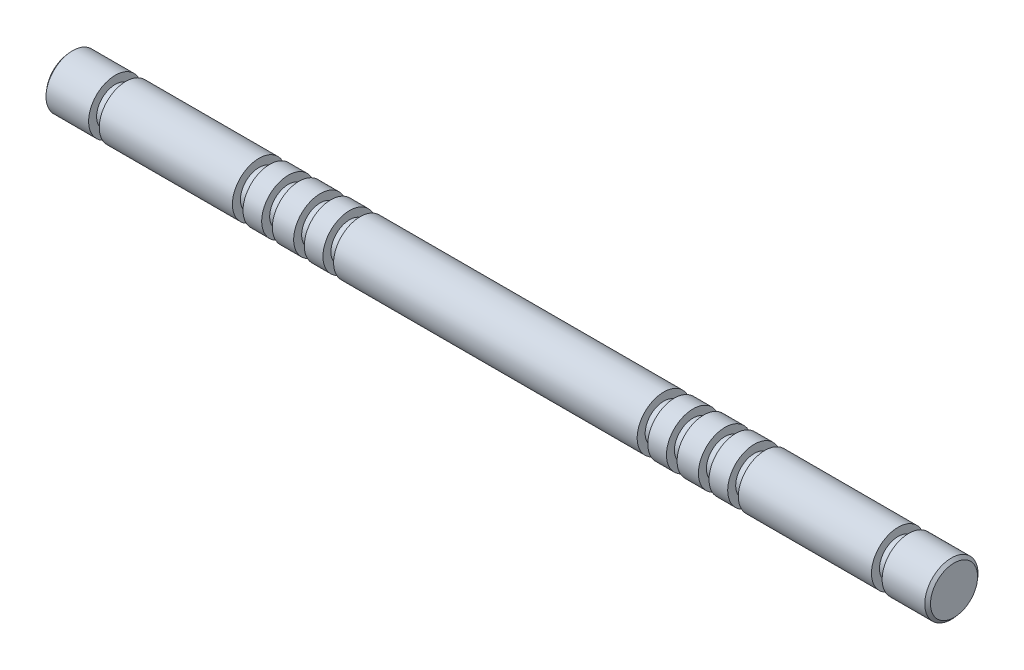
ISO-10303-21;
HEADER;
FILE_DESCRIPTION(('STEP AP214'),'2;1');
FILE_NAME('part.step','',(''),(''),'','','');
FILE_SCHEMA(('AUTOMOTIVE_DESIGN { 1 0 10303 214 1 1 1 1 }'));
ENDSEC;
DATA;
#1=APPLICATION_CONTEXT('core data for automotive mechanical design processes');
#2=APPLICATION_PROTOCOL_DEFINITION('international standard','automotive_design',2000,#1);
#3=PRODUCT_CONTEXT('',#1,'mechanical');
#4=PRODUCT('Part','Part','',(#3));
#5=PRODUCT_RELATED_PRODUCT_CATEGORY('part','',(#4));
#6=PRODUCT_DEFINITION_FORMATION('','',#4);
#7=PRODUCT_DEFINITION_CONTEXT('part definition',#1,'design');
#8=PRODUCT_DEFINITION('design','',#6,#7);
#9=PRODUCT_DEFINITION_SHAPE('','',#8);
#10=(LENGTH_UNIT() NAMED_UNIT(*) SI_UNIT(.MILLI.,.METRE.));
#11=(NAMED_UNIT(*) PLANE_ANGLE_UNIT() SI_UNIT($,.RADIAN.));
#12=(NAMED_UNIT(*) SI_UNIT($,.STERADIAN.) SOLID_ANGLE_UNIT());
#13=UNCERTAINTY_MEASURE_WITH_UNIT(LENGTH_MEASURE(1.E-05),#10,'distance_accuracy_value','');
#14=(GEOMETRIC_REPRESENTATION_CONTEXT(3) GLOBAL_UNCERTAINTY_ASSIGNED_CONTEXT((#13)) GLOBAL_UNIT_ASSIGNED_CONTEXT((#10,
#11,#12)) REPRESENTATION_CONTEXT('',''));
#15=CARTESIAN_POINT('',(0.,0.,0.));
#16=DIRECTION('',(0.,0.,1.));
#17=DIRECTION('',(1.,0.,0.));
#18=AXIS2_PLACEMENT_3D('',#15,#16,#17);
#19=CARTESIAN_POINT('',(52.,0.,0.));
#20=DIRECTION('',(-1.,0.,0.));
#21=DIRECTION('',(0.,0.,1.));
#22=AXIS2_PLACEMENT_3D('',#19,#20,#21);
#23=CYLINDRICAL_SURFACE('',#22,5.);
#24=CARTESIAN_POINT('',(54.5,0.,0.));
#25=DIRECTION('',(1.,0.,0.));
#26=DIRECTION('',(0.,0.,-1.));
#27=AXIS2_PLACEMENT_3D('',#24,#25,#26);
#28=CIRCLE('',#27,5.);
#29=CARTESIAN_POINT('',(54.5,0.,5.));
#30=VERTEX_POINT('',#29);
#31=EDGE_CURVE('E192',#30,#30,#28,.T.);
#32=CARTESIAN_POINT('',(-2.5,0.,0.));
#33=DIRECTION('',(1.,0.,0.));
#34=DIRECTION('',(0.,0.,-1.));
#35=AXIS2_PLACEMENT_3D('',#32,#33,#34);
#36=CIRCLE('',#35,5.);
#37=CARTESIAN_POINT('',(-2.5,0.,5.));
#38=VERTEX_POINT('',#37);
#39=EDGE_CURVE('E208',#38,#38,#36,.T.);
#40=CARTESIAN_POINT('',(54.5,0.,5.));
#41=CARTESIAN_POINT('',(53.90625,0.,5.));
#42=CARTESIAN_POINT('',(53.3125,0.,5.));
#43=CARTESIAN_POINT('',(52.125,0.,5.));
#44=CARTESIAN_POINT('',(51.53125,0.,5.));
#45=CARTESIAN_POINT('',(50.34375,0.,5.));
#46=CARTESIAN_POINT('',(49.75,0.,5.));
#47=CARTESIAN_POINT('',(48.5625,0.,5.));
#48=CARTESIAN_POINT('',(47.96875,0.,5.));
#49=CARTESIAN_POINT('',(46.78125,0.,5.));
#50=CARTESIAN_POINT('',(46.1875,0.,5.));
#51=CARTESIAN_POINT('',(45.,0.,5.));
#52=CARTESIAN_POINT('',(44.40625,0.,5.));
#53=CARTESIAN_POINT('',(43.21875,0.,5.));
#54=CARTESIAN_POINT('',(42.625,0.,5.));
#55=CARTESIAN_POINT('',(41.4375,0.,5.));
#56=CARTESIAN_POINT('',(40.84375,0.,5.));
#57=CARTESIAN_POINT('',(39.65625,0.,5.));
#58=CARTESIAN_POINT('',(39.0625,0.,5.));
#59=CARTESIAN_POINT('',(37.875,0.,5.));
#60=CARTESIAN_POINT('',(37.28125,0.,5.));
#61=CARTESIAN_POINT('',(36.09375,0.,5.));
#62=CARTESIAN_POINT('',(35.5,0.,5.));
#63=CARTESIAN_POINT('',(34.3125,0.,5.));
#64=CARTESIAN_POINT('',(33.71875,0.,5.));
#65=CARTESIAN_POINT('',(32.53125,0.,5.));
#66=CARTESIAN_POINT('',(31.9375,0.,5.));
#67=CARTESIAN_POINT('',(30.75,0.,5.));
#68=CARTESIAN_POINT('',(30.15625,0.,5.));
#69=CARTESIAN_POINT('',(28.96875,0.,5.));
#70=CARTESIAN_POINT('',(28.375,0.,5.));
#71=CARTESIAN_POINT('',(27.1875,0.,5.));
#72=CARTESIAN_POINT('',(26.59375,0.,5.));
#73=CARTESIAN_POINT('',(25.40625,0.,5.));
#74=CARTESIAN_POINT('',(24.8125,0.,5.));
#75=CARTESIAN_POINT('',(23.625,0.,5.));
#76=CARTESIAN_POINT('',(23.03125,0.,5.));
#77=CARTESIAN_POINT('',(21.84375,0.,5.));
#78=CARTESIAN_POINT('',(21.25,0.,5.));
#79=CARTESIAN_POINT('',(20.0625,0.,5.));
#80=CARTESIAN_POINT('',(19.46875,0.,5.));
#81=CARTESIAN_POINT('',(18.28125,0.,5.));
#82=CARTESIAN_POINT('',(17.6875,0.,5.));
#83=CARTESIAN_POINT('',(16.5,0.,5.));
#84=CARTESIAN_POINT('',(15.90625,0.,5.));
#85=CARTESIAN_POINT('',(14.71875,0.,5.));
#86=CARTESIAN_POINT('',(14.125,0.,5.));
#87=CARTESIAN_POINT('',(12.9375,0.,5.));
#88=CARTESIAN_POINT('',(12.34375,0.,5.));
#89=CARTESIAN_POINT('',(11.15625,0.,5.));
#90=CARTESIAN_POINT('',(10.5625,0.,5.));
#91=CARTESIAN_POINT('',(9.375,0.,5.));
#92=CARTESIAN_POINT('',(8.78125,0.,5.));
#93=CARTESIAN_POINT('',(7.59375,0.,5.));
#94=CARTESIAN_POINT('',(7.,0.,5.));
#95=CARTESIAN_POINT('',(5.8125,0.,5.));
#96=CARTESIAN_POINT('',(5.21875,0.,5.));
#97=CARTESIAN_POINT('',(4.03125,0.,5.));
#98=CARTESIAN_POINT('',(3.4375,0.,5.));
#99=CARTESIAN_POINT('',(2.25,0.,5.));
#100=CARTESIAN_POINT('',(1.65625,0.,5.));
#101=CARTESIAN_POINT('',(0.468749999999999,0.,5.));
#102=CARTESIAN_POINT('',(-0.125000000000002,0.,5.));
#103=CARTESIAN_POINT('',(-1.3125,0.,5.));
#104=CARTESIAN_POINT('',(-1.90625,0.,5.));
#105=CARTESIAN_POINT('',(-2.5,0.,5.));
#106=B_SPLINE_CURVE_WITH_KNOTS('',3,(#40,#41,#42,#43,#44,#45,#46,#47,#48,#49,#50,#51,#52,#53,
#54,#55,#56,#57,#58,#59,#60,#61,#62,#63,#64,#65,#66,#67,#68,#69,#70,#71,#72,#73,#74,#75,#76,#77,
#78,#79,#80,#81,#82,#83,#84,#85,#86,#87,#88,#89,#90,#91,#92,#93,#94,#95,#96,#97,#98,#99,#100,
#101,#102,#103,#104,#105),.UNSPECIFIED.,.F.,.F.,(4,2,2,2,2,2,2,2,2,2,2,2,2,2,2,2,2,2,2,2,2,2,2,
2,2,2,2,2,2,2,2,2,4),(0.,1.78125000000001,3.5625,5.34375,7.125,8.90625,10.6875,12.46875,14.25,
16.03125,17.8125,19.59375,21.375,23.15625,24.9375,26.71875,28.5,30.28125,32.0625,33.84375,
35.625,37.40625,39.1875,40.96875,42.75,44.53125,46.3125,48.09375,49.875,51.65625,53.4375,
55.21875,57.),.UNSPECIFIED.);
#107=EDGE_CURVE('BSEAM38',#30,#38,#106,.T.);
#108=ORIENTED_EDGE('',*,*,#31,.F.);
#109=ORIENTED_EDGE('',*,*,#39,.T.);
#110=ORIENTED_EDGE('',*,*,#107,.T.);
#111=ORIENTED_EDGE('',*,*,#107,.F.);
#112=EDGE_LOOP('',(#108,#110,#109,#111));
#113=FACE_BOUND('',#112,.T.);
#114=ADVANCED_FACE('F38',(#113),#23,.T.);
#115=CARTESIAN_POINT('',(68.,0.,0.));
#116=DIRECTION('',(-1.,0.,0.));
#117=DIRECTION('',(0.,0.,1.));
#118=AXIS2_PLACEMENT_3D('',#115,#116,#117);
#119=CYLINDRICAL_SURFACE('',#118,5.);
#120=CARTESIAN_POINT('',(73.5,0.,0.));
#121=DIRECTION('',(-1.,0.,0.));
#122=DIRECTION('',(0.,0.,1.));
#123=AXIS2_PLACEMENT_3D('',#120,#121,#122);
#124=CIRCLE('',#123,5.);
#125=CARTESIAN_POINT('',(73.5,0.,5.));
#126=VERTEX_POINT('',#125);
#127=EDGE_CURVE('E128',#126,#126,#124,.T.);
#128=ORIENTED_EDGE('',*,*,#127,.F.);
#129=EDGE_LOOP('',(#128));
#130=FACE_BOUND('',#129,.T.);
#131=CARTESIAN_POINT('',(98.5,0.,0.));
#132=DIRECTION('',(1.,0.,0.));
#133=DIRECTION('',(0.,0.,-1.));
#134=AXIS2_PLACEMENT_3D('',#131,#132,#133);
#135=CIRCLE('',#134,5.);
#136=CARTESIAN_POINT('',(98.5,0.,-5.));
#137=VERTEX_POINT('',#136);
#138=EDGE_CURVE('E144',#137,#137,#135,.T.);
#139=ORIENTED_EDGE('',*,*,#138,.F.);
#140=EDGE_LOOP('',(#139));
#141=FACE_BOUND('',#140,.T.);
#142=ADVANCED_FACE('F257',(#130,#141),#119,.T.);
#143=CARTESIAN_POINT('',(56.5,0.,0.));
#144=DIRECTION('',(1.,0.,0.));
#145=DIRECTION('',(0.,0.,-1.));
#146=AXIS2_PLACEMENT_3D('',#143,#144,#145);
#147=CIRCLE('',#146,5.);
#148=CARTESIAN_POINT('',(56.5,0.,5.));
#149=VERTEX_POINT('',#148);
#150=EDGE_CURVE('E188',#149,#149,#147,.T.);
#151=CARTESIAN_POINT('',(60.,0.,0.));
#152=DIRECTION('',(1.,0.,0.));
#153=DIRECTION('',(0.,0.,-1.));
#154=AXIS2_PLACEMENT_3D('',#151,#152,#153);
#155=CIRCLE('',#154,5.);
#156=CARTESIAN_POINT('',(60.,0.,5.));
#157=VERTEX_POINT('',#156);
#158=EDGE_CURVE('E96',#157,#157,#155,.T.);
#159=CARTESIAN_POINT('',(56.5,0.,5.));
#160=CARTESIAN_POINT('',(56.5364583333333,0.,5.));
#161=CARTESIAN_POINT('',(56.5729166666667,0.,5.));
#162=CARTESIAN_POINT('',(56.6458333333333,0.,5.));
#163=CARTESIAN_POINT('',(56.6822916666667,0.,5.));
#164=CARTESIAN_POINT('',(56.7552083333333,0.,5.));
#165=CARTESIAN_POINT('',(56.7916666666667,0.,5.));
#166=CARTESIAN_POINT('',(56.8645833333333,0.,5.));
#167=CARTESIAN_POINT('',(56.9010416666667,0.,5.));
#168=CARTESIAN_POINT('',(56.9739583333333,0.,5.));
#169=CARTESIAN_POINT('',(57.0104166666667,0.,5.));
#170=CARTESIAN_POINT('',(57.0833333333333,0.,5.));
#171=CARTESIAN_POINT('',(57.1197916666667,0.,5.));
#172=CARTESIAN_POINT('',(57.1927083333333,0.,5.));
#173=CARTESIAN_POINT('',(57.2291666666667,0.,5.));
#174=CARTESIAN_POINT('',(57.3020833333333,0.,5.));
#175=CARTESIAN_POINT('',(57.3385416666667,0.,5.));
#176=CARTESIAN_POINT('',(57.4114583333333,0.,5.));
#177=CARTESIAN_POINT('',(57.4479166666667,0.,5.));
#178=CARTESIAN_POINT('',(57.5208333333333,0.,5.));
#179=CARTESIAN_POINT('',(57.5572916666667,0.,5.));
#180=CARTESIAN_POINT('',(57.6302083333333,0.,5.));
#181=CARTESIAN_POINT('',(57.6666666666667,0.,5.));
#182=CARTESIAN_POINT('',(57.7395833333333,0.,5.));
#183=CARTESIAN_POINT('',(57.7760416666667,0.,5.));
#184=CARTESIAN_POINT('',(57.8489583333333,0.,5.));
#185=CARTESIAN_POINT('',(57.8854166666667,0.,5.));
#186=CARTESIAN_POINT('',(57.9583333333333,0.,5.));
#187=CARTESIAN_POINT('',(57.9947916666667,0.,5.));
#188=CARTESIAN_POINT('',(58.0677083333333,0.,5.));
#189=CARTESIAN_POINT('',(58.1041666666667,0.,5.));
#190=CARTESIAN_POINT('',(58.1770833333333,0.,5.));
#191=CARTESIAN_POINT('',(58.2135416666667,0.,5.));
#192=CARTESIAN_POINT('',(58.2864583333333,0.,5.));
#193=CARTESIAN_POINT('',(58.3229166666667,0.,5.));
#194=CARTESIAN_POINT('',(58.3958333333333,0.,5.));
#195=CARTESIAN_POINT('',(58.4322916666667,0.,5.));
#196=CARTESIAN_POINT('',(58.5052083333333,0.,5.));
#197=CARTESIAN_POINT('',(58.5416666666667,0.,5.));
#198=CARTESIAN_POINT('',(58.6145833333333,0.,5.));
#199=CARTESIAN_POINT('',(58.6510416666667,0.,5.));
#200=CARTESIAN_POINT('',(58.7239583333333,0.,5.));
#201=CARTESIAN_POINT('',(58.7604166666667,0.,5.));
#202=CARTESIAN_POINT('',(58.8333333333333,0.,5.));
#203=CARTESIAN_POINT('',(58.8697916666667,0.,5.));
#204=CARTESIAN_POINT('',(58.9427083333333,0.,5.));
#205=CARTESIAN_POINT('',(58.9791666666667,0.,5.));
#206=CARTESIAN_POINT('',(59.0520833333333,0.,5.));
#207=CARTESIAN_POINT('',(59.0885416666667,0.,5.));
#208=CARTESIAN_POINT('',(59.1614583333333,0.,5.));
#209=CARTESIAN_POINT('',(59.1979166666667,0.,5.));
#210=CARTESIAN_POINT('',(59.2708333333333,0.,5.));
#211=CARTESIAN_POINT('',(59.3072916666667,0.,5.));
#212=CARTESIAN_POINT('',(59.3802083333333,0.,5.));
#213=CARTESIAN_POINT('',(59.4166666666667,0.,5.));
#214=CARTESIAN_POINT('',(59.4895833333333,0.,5.));
#215=CARTESIAN_POINT('',(59.5260416666667,0.,5.));
#216=CARTESIAN_POINT('',(59.5989583333333,0.,5.));
#217=CARTESIAN_POINT('',(59.6354166666667,0.,5.));
#218=CARTESIAN_POINT('',(59.7083333333333,0.,5.));
#219=CARTESIAN_POINT('',(59.7447916666667,0.,5.));
#220=CARTESIAN_POINT('',(59.8177083333333,0.,5.));
#221=CARTESIAN_POINT('',(59.8541666666667,0.,5.));
#222=CARTESIAN_POINT('',(59.9270833333333,0.,5.));
#223=CARTESIAN_POINT('',(59.9635416666667,0.,5.));
#224=CARTESIAN_POINT('',(60.,0.,5.));
#225=B_SPLINE_CURVE_WITH_KNOTS('',3,(#159,#160,#161,#162,#163,#164,#165,#166,#167,#168,#169,
#170,#171,#172,#173,#174,#175,#176,#177,#178,#179,#180,#181,#182,#183,#184,#185,#186,#187,#188,
#189,#190,#191,#192,#193,#194,#195,#196,#197,#198,#199,#200,#201,#202,#203,#204,#205,#206,#207,
#208,#209,#210,#211,#212,#213,#214,#215,#216,#217,#218,#219,#220,#221,#222,#223,#224),
.UNSPECIFIED.,.F.,.F.,(4,2,2,2,2,2,2,2,2,2,2,2,2,2,2,2,2,2,2,2,2,2,2,2,2,2,2,2,2,2,2,2,4),(0.,
0.109374999999995,0.218749999999997,0.328124999999999,0.4375,0.546874999999995,
0.656249999999997,0.765624999999999,0.874999999999994,0.984374999999996,1.09375,
1.20312499999999,1.31249999999999,1.421875,1.53125,1.64062499999999,1.74999999999999,1.859375,
1.96874999999999,2.07812499999999,2.1875,2.296875,2.40624999999999,2.51562499999999,2.625,
2.73437499999999,2.84374999999999,2.95312499999999,3.06249999999999,3.17187499999999,
3.28124999999999,3.39062499999999,3.49999999999999),.UNSPECIFIED.);
#226=EDGE_CURVE('BSEAM240',#149,#157,#225,.T.);
#227=ORIENTED_EDGE('',*,*,#150,.T.);
#228=ORIENTED_EDGE('',*,*,#158,.F.);
#229=ORIENTED_EDGE('',*,*,#226,.T.);
#230=ORIENTED_EDGE('',*,*,#226,.F.);
#231=EDGE_LOOP('',(#227,#229,#228,#230));
#232=FACE_BOUND('',#231,.T.);
#233=ADVANCED_FACE('F240',(#232),#23,.T.);
#234=CARTESIAN_POINT('',(71.5,0.,0.));
#235=DIRECTION('',(-1.,0.,0.));
#236=DIRECTION('',(0.,0.,1.));
#237=AXIS2_PLACEMENT_3D('',#234,#235,#236);
#238=CIRCLE('',#237,5.);
#239=CARTESIAN_POINT('',(71.5,0.,5.));
#240=VERTEX_POINT('',#239);
#241=EDGE_CURVE('E124',#240,#240,#238,.T.);
#242=ORIENTED_EDGE('',*,*,#241,.T.);
#243=EDGE_LOOP('',(#242));
#244=FACE_BOUND('',#243,.T.);
#245=CARTESIAN_POINT('',(68.,0.,0.));
#246=DIRECTION('',(1.,0.,0.));
#247=DIRECTION('',(0.,0.,-1.));
#248=AXIS2_PLACEMENT_3D('',#245,#246,#247);
#249=CIRCLE('',#248,5.);
#250=CARTESIAN_POINT('',(68.,0.,-5.));
#251=VERTEX_POINT('',#250);
#252=EDGE_CURVE('E108',#251,#251,#249,.T.);
#253=ORIENTED_EDGE('',*,*,#252,.T.);
#254=EDGE_LOOP('',(#253));
#255=FACE_BOUND('',#254,.T.);
#256=ADVANCED_FACE('F267',(#244,#255),#119,.T.);
#257=CARTESIAN_POINT('',(68.,0.,0.));
#258=DIRECTION('',(-1.,0.,0.));
#259=DIRECTION('',(0.,0.,-1.));
#260=AXIS2_PLACEMENT_3D('',#257,#258,#259);
#261=PLANE('',#260);
#262=ORIENTED_EDGE('',*,*,#252,.F.);
#263=EDGE_LOOP('',(#262));
#264=FACE_BOUND('',#263,.T.);
#265=CARTESIAN_POINT('',(68.,0.,0.));
#266=DIRECTION('',(1.,0.,0.));
#267=DIRECTION('',(0.,0.,-1.));
#268=AXIS2_PLACEMENT_3D('',#265,#266,#267);
#269=CIRCLE('',#268,3.5);
#270=CARTESIAN_POINT('',(68.,0.,-3.5));
#271=VERTEX_POINT('',#270);
#272=EDGE_CURVE('E116',#271,#271,#269,.T.);
#273=ORIENTED_EDGE('',*,*,#272,.T.);
#274=EDGE_LOOP('',(#273));
#275=FACE_BOUND('',#274,.T.);
#276=ADVANCED_FACE('F277',(#264,#275),#261,.T.);
#277=CARTESIAN_POINT('',(68.,0.,0.));
#278=DIRECTION('',(-1.,0.,0.));
#279=DIRECTION('',(0.,0.,1.));
#280=AXIS2_PLACEMENT_3D('',#277,#278,#279);
#281=CYLINDRICAL_SURFACE('',#280,3.5);
#282=ORIENTED_EDGE('',*,*,#272,.F.);
#283=EDGE_LOOP('',(#282));
#284=FACE_BOUND('',#283,.T.);
#285=CARTESIAN_POINT('',(66.,0.,0.));
#286=DIRECTION('',(1.,0.,0.));
#287=DIRECTION('',(0.,0.,-1.));
#288=AXIS2_PLACEMENT_3D('',#285,#286,#287);
#289=CIRCLE('',#288,3.5);
#290=CARTESIAN_POINT('',(66.,0.,-3.5));
#291=VERTEX_POINT('',#290);
#292=EDGE_CURVE('E120',#291,#291,#289,.T.);
#293=ORIENTED_EDGE('',*,*,#292,.T.);
#294=EDGE_LOOP('',(#293));
#295=FACE_BOUND('',#294,.T.);
#296=ADVANCED_FACE('F410',(#284,#295),#281,.T.);
#297=CARTESIAN_POINT('',(66.,0.,0.));
#298=DIRECTION('',(-1.,0.,0.));
#299=DIRECTION('',(0.,0.,-1.));
#300=AXIS2_PLACEMENT_3D('',#297,#298,#299);
#301=PLANE('',#300);
#302=CARTESIAN_POINT('',(66.,0.,0.));
#303=DIRECTION('',(1.,0.,0.));
#304=DIRECTION('',(0.,0.,-1.));
#305=AXIS2_PLACEMENT_3D('',#302,#303,#304);
#306=CIRCLE('',#305,5.);
#307=CARTESIAN_POINT('',(66.,0.,-5.));
#308=VERTEX_POINT('',#307);
#309=EDGE_CURVE('E112',#308,#308,#306,.T.);
#310=ORIENTED_EDGE('',*,*,#309,.T.);
#311=EDGE_LOOP('',(#310));
#312=FACE_BOUND('',#311,.T.);
#313=ORIENTED_EDGE('',*,*,#292,.F.);
#314=EDGE_LOOP('',(#313));
#315=FACE_BOUND('',#314,.T.);
#316=ADVANCED_FACE('F303',(#312,#315),#301,.F.);
#317=ORIENTED_EDGE('',*,*,#309,.F.);
#318=EDGE_LOOP('',(#317));
#319=FACE_BOUND('',#318,.T.);
#320=CARTESIAN_POINT('',(62.,0.,0.));
#321=DIRECTION('',(1.,0.,0.));
#322=DIRECTION('',(0.,0.,-1.));
#323=AXIS2_PLACEMENT_3D('',#320,#321,#322);
#324=CIRCLE('',#323,5.);
#325=CARTESIAN_POINT('',(62.,0.,-5.));
#326=VERTEX_POINT('',#325);
#327=EDGE_CURVE('E92',#326,#326,#324,.T.);
#328=ORIENTED_EDGE('',*,*,#327,.T.);
#329=EDGE_LOOP('',(#328));
#330=FACE_BOUND('',#329,.T.);
#331=ADVANCED_FACE('F279',(#319,#330),#119,.T.);
#332=CARTESIAN_POINT('',(62.,0.,0.));
#333=DIRECTION('',(-1.,0.,0.));
#334=DIRECTION('',(0.,0.,-1.));
#335=AXIS2_PLACEMENT_3D('',#332,#333,#334);
#336=PLANE('',#335);
#337=ORIENTED_EDGE('',*,*,#327,.F.);
#338=EDGE_LOOP('',(#337));
#339=FACE_BOUND('',#338,.T.);
#340=CARTESIAN_POINT('',(62.,0.,0.));
#341=DIRECTION('',(1.,0.,0.));
#342=DIRECTION('',(0.,0.,-1.));
#343=AXIS2_PLACEMENT_3D('',#340,#341,#342);
#344=CIRCLE('',#343,3.5);
#345=CARTESIAN_POINT('',(62.,0.,-3.5));
#346=VERTEX_POINT('',#345);
#347=EDGE_CURVE('E100',#346,#346,#344,.T.);
#348=ORIENTED_EDGE('',*,*,#347,.T.);
#349=EDGE_LOOP('',(#348));
#350=FACE_BOUND('',#349,.T.);
#351=ADVANCED_FACE('F293',(#339,#350),#336,.T.);
#352=CARTESIAN_POINT('',(62.,0.,0.));
#353=DIRECTION('',(-1.,0.,0.));
#354=DIRECTION('',(0.,0.,1.));
#355=AXIS2_PLACEMENT_3D('',#352,#353,#354);
#356=CYLINDRICAL_SURFACE('',#355,3.5);
#357=ORIENTED_EDGE('',*,*,#347,.F.);
#358=EDGE_LOOP('',(#357));
#359=FACE_BOUND('',#358,.T.);
#360=CARTESIAN_POINT('',(60.,0.,0.));
#361=DIRECTION('',(1.,0.,0.));
#362=DIRECTION('',(0.,0.,-1.));
#363=AXIS2_PLACEMENT_3D('',#360,#361,#362);
#364=CIRCLE('',#363,3.5);
#365=CARTESIAN_POINT('',(60.,0.,-3.5));
#366=VERTEX_POINT('',#365);
#367=EDGE_CURVE('E104',#366,#366,#364,.T.);
#368=ORIENTED_EDGE('',*,*,#367,.T.);
#369=EDGE_LOOP('',(#368));
#370=FACE_BOUND('',#369,.T.);
#371=ADVANCED_FACE('F288',(#359,#370),#356,.T.);
#372=CARTESIAN_POINT('',(60.,0.,0.));
#373=DIRECTION('',(-1.,0.,0.));
#374=DIRECTION('',(0.,0.,-1.));
#375=AXIS2_PLACEMENT_3D('',#372,#373,#374);
#376=PLANE('',#375);
#377=ORIENTED_EDGE('',*,*,#158,.T.);
#378=EDGE_LOOP('',(#377));
#379=FACE_BOUND('',#378,.T.);
#380=ORIENTED_EDGE('',*,*,#367,.F.);
#381=EDGE_LOOP('',(#380));
#382=FACE_BOUND('',#381,.T.);
#383=ADVANCED_FACE('F284',(#379,#382),#376,.F.);
#384=CARTESIAN_POINT('',(71.5,0.,0.));
#385=DIRECTION('',(-1.,0.,0.));
#386=DIRECTION('',(0.,0.,1.));
#387=AXIS2_PLACEMENT_3D('',#384,#385,#386);
#388=PLANE('',#387);
#389=ORIENTED_EDGE('',*,*,#241,.F.);
#390=EDGE_LOOP('',(#389));
#391=FACE_BOUND('',#390,.T.);
#392=CARTESIAN_POINT('',(71.5,0.,0.));
#393=DIRECTION('',(-1.,0.,0.));
#394=DIRECTION('',(0.,0.,1.));
#395=AXIS2_PLACEMENT_3D('',#392,#393,#394);
#396=CIRCLE('',#395,3.5);
#397=CARTESIAN_POINT('',(71.5,0.,3.5));
#398=VERTEX_POINT('',#397);
#399=EDGE_CURVE('E132',#398,#398,#396,.T.);
#400=ORIENTED_EDGE('',*,*,#399,.T.);
#401=EDGE_LOOP('',(#400));
#402=FACE_BOUND('',#401,.T.);
#403=ADVANCED_FACE('F287',(#391,#402),#388,.F.);
#404=CARTESIAN_POINT('',(73.5,0.,0.));
#405=DIRECTION('',(-1.,0.,0.));
#406=DIRECTION('',(0.,0.,1.));
#407=AXIS2_PLACEMENT_3D('',#404,#405,#406);
#408=PLANE('',#407);
#409=ORIENTED_EDGE('',*,*,#127,.T.);
#410=EDGE_LOOP('',(#409));
#411=FACE_BOUND('',#410,.T.);
#412=CARTESIAN_POINT('',(73.5,0.,0.));
#413=DIRECTION('',(-1.,0.,0.));
#414=DIRECTION('',(0.,0.,1.));
#415=AXIS2_PLACEMENT_3D('',#412,#413,#414);
#416=CIRCLE('',#415,3.5);
#417=CARTESIAN_POINT('',(73.5,0.,3.5));
#418=VERTEX_POINT('',#417);
#419=EDGE_CURVE('E136',#418,#418,#416,.T.);
#420=ORIENTED_EDGE('',*,*,#419,.F.);
#421=EDGE_LOOP('',(#420));
#422=FACE_BOUND('',#421,.T.);
#423=ADVANCED_FACE('F398',(#411,#422),#408,.T.);
#424=CARTESIAN_POINT('',(71.5,0.,0.));
#425=DIRECTION('',(1.,0.,0.));
#426=DIRECTION('',(0.,0.,-1.));
#427=AXIS2_PLACEMENT_3D('',#424,#425,#426);
#428=CYLINDRICAL_SURFACE('',#427,3.5);
#429=ORIENTED_EDGE('',*,*,#399,.F.);
#430=EDGE_LOOP('',(#429));
#431=FACE_BOUND('',#430,.T.);
#432=ORIENTED_EDGE('',*,*,#419,.T.);
#433=EDGE_LOOP('',(#432));
#434=FACE_BOUND('',#433,.T.);
#435=ADVANCED_FACE('F391',(#431,#434),#428,.T.);
#436=CARTESIAN_POINT('',(100.5,0.,0.));
#437=DIRECTION('',(1.,0.,0.));
#438=DIRECTION('',(0.,0.,-1.));
#439=AXIS2_PLACEMENT_3D('',#436,#437,#438);
#440=PLANE('',#439);
#441=CARTESIAN_POINT('',(100.5,0.,0.));
#442=DIRECTION('',(1.,0.,0.));
#443=DIRECTION('',(0.,0.,-1.));
#444=AXIS2_PLACEMENT_3D('',#441,#442,#443);
#445=CIRCLE('',#444,5.);
#446=CARTESIAN_POINT('',(100.5,0.,-5.));
#447=VERTEX_POINT('',#446);
#448=EDGE_CURVE('E140',#447,#447,#445,.T.);
#449=ORIENTED_EDGE('',*,*,#448,.F.);
#450=EDGE_LOOP('',(#449));
#451=FACE_BOUND('',#450,.T.);
#452=CARTESIAN_POINT('',(100.5,0.,0.));
#453=DIRECTION('',(1.,0.,0.));
#454=DIRECTION('',(0.,0.,-1.));
#455=AXIS2_PLACEMENT_3D('',#452,#453,#454);
#456=CIRCLE('',#455,3.5);
#457=CARTESIAN_POINT('',(100.5,0.,-3.5));
#458=VERTEX_POINT('',#457);
#459=EDGE_CURVE('E148',#458,#458,#456,.T.);
#460=ORIENTED_EDGE('',*,*,#459,.T.);
#461=EDGE_LOOP('',(#460));
#462=FACE_BOUND('',#461,.T.);
#463=ADVANCED_FACE('F388',(#451,#462),#440,.F.);
#464=CARTESIAN_POINT('',(98.5,0.,0.));
#465=DIRECTION('',(1.,0.,0.));
#466=DIRECTION('',(0.,0.,-1.));
#467=AXIS2_PLACEMENT_3D('',#464,#465,#466);
#468=PLANE('',#467);
#469=ORIENTED_EDGE('',*,*,#138,.T.);
#470=EDGE_LOOP('',(#469));
#471=FACE_BOUND('',#470,.T.);
#472=CARTESIAN_POINT('',(98.5,0.,0.));
#473=DIRECTION('',(1.,0.,0.));
#474=DIRECTION('',(0.,0.,-1.));
#475=AXIS2_PLACEMENT_3D('',#472,#473,#474);
#476=CIRCLE('',#475,3.5);
#477=CARTESIAN_POINT('',(98.5,0.,-3.5));
#478=VERTEX_POINT('',#477);
#479=EDGE_CURVE('E152',#478,#478,#476,.T.);
#480=ORIENTED_EDGE('',*,*,#479,.F.);
#481=EDGE_LOOP('',(#480));
#482=FACE_BOUND('',#481,.T.);
#483=ADVANCED_FACE('F386',(#471,#482),#468,.T.);
#484=CARTESIAN_POINT('',(100.5,0.,0.));
#485=DIRECTION('',(-1.,0.,0.));
#486=DIRECTION('',(0.,0.,1.));
#487=AXIS2_PLACEMENT_3D('',#484,#485,#486);
#488=CYLINDRICAL_SURFACE('',#487,3.5);
#489=ORIENTED_EDGE('',*,*,#459,.F.);
#490=EDGE_LOOP('',(#489));
#491=FACE_BOUND('',#490,.T.);
#492=ORIENTED_EDGE('',*,*,#479,.T.);
#493=EDGE_LOOP('',(#492));
#494=FACE_BOUND('',#493,.T.);
#495=ADVANCED_FACE('F382',(#491,#494),#488,.T.);
#496=CARTESIAN_POINT('',(109.,0.,0.));
#497=DIRECTION('',(1.,0.,0.));
#498=DIRECTION('',(0.,0.,-1.));
#499=AXIS2_PLACEMENT_3D('',#496,#497,#498);
#500=PLANE('',#499);
#501=CARTESIAN_POINT('',(109.,0.,0.));
#502=DIRECTION('',(1.,0.,0.));
#503=DIRECTION('',(0.,0.,-1.));
#504=AXIS2_PLACEMENT_3D('',#501,#502,#503);
#505=CIRCLE('',#504,4.42481579638951);
#506=CARTESIAN_POINT('',(109.,0.,-4.42481579638951));
#507=VERTEX_POINT('',#506);
#508=EDGE_CURVE('E57',#507,#507,#505,.T.);
#509=ORIENTED_EDGE('',*,*,#508,.T.);
#510=EDGE_LOOP('',(#509));
#511=FACE_BOUND('',#510,.T.);
#512=ADVANCED_FACE('F385',(#511),#500,.T.);
#513=CARTESIAN_POINT('',(108.5,0.,0.));
#514=DIRECTION('',(1.,0.,0.));
#515=DIRECTION('',(0.,0.,-1.));
#516=AXIS2_PLACEMENT_3D('',#513,#514,#515);
#517=CIRCLE('',#516,5.);
#518=CARTESIAN_POINT('',(108.5,0.,-5.));
#519=VERTEX_POINT('',#518);
#520=EDGE_CURVE('E52',#519,#519,#517,.F.);
#521=ORIENTED_EDGE('',*,*,#520,.T.);
#522=EDGE_LOOP('',(#521));
#523=FACE_BOUND('',#522,.T.);
#524=ORIENTED_EDGE('',*,*,#448,.T.);
#525=EDGE_LOOP('',(#524));
#526=FACE_BOUND('',#525,.T.);
#527=ADVANCED_FACE('F266',(#523,#526),#119,.T.);
#528=CARTESIAN_POINT('',(109.,0.,0.));
#529=DIRECTION('',(-1.,0.,0.));
#530=DIRECTION('',(0.,0.,1.));
#531=AXIS2_PLACEMENT_3D('',#528,#529,#530);
#532=CONICAL_SURFACE('',#531,4.42481579638951,0.85521133347721);
#533=ORIENTED_EDGE('',*,*,#520,.F.);
#534=EDGE_LOOP('',(#533));
#535=FACE_BOUND('',#534,.T.);
#536=ORIENTED_EDGE('',*,*,#508,.F.);
#537=EDGE_LOOP('',(#536));
#538=FACE_BOUND('',#537,.T.);
#539=ADVANCED_FACE('F437',(#535,#538),#532,.T.);
#540=CARTESIAN_POINT('',(56.5,0.,0.));
#541=DIRECTION('',(1.,0.,0.));
#542=DIRECTION('',(0.,0.,-1.));
#543=AXIS2_PLACEMENT_3D('',#540,#541,#542);
#544=PLANE('',#543);
#545=ORIENTED_EDGE('',*,*,#150,.F.);
#546=EDGE_LOOP('',(#545));
#547=FACE_BOUND('',#546,.T.);
#548=CARTESIAN_POINT('',(56.5,0.,0.));
#549=DIRECTION('',(1.,0.,0.));
#550=DIRECTION('',(0.,0.,-1.));
#551=AXIS2_PLACEMENT_3D('',#548,#549,#550);
#552=CIRCLE('',#551,3.5);
#553=CARTESIAN_POINT('',(56.5,0.,-3.5));
#554=VERTEX_POINT('',#553);
#555=EDGE_CURVE('E196',#554,#554,#552,.T.);
#556=ORIENTED_EDGE('',*,*,#555,.T.);
#557=EDGE_LOOP('',(#556));
#558=FACE_BOUND('',#557,.T.);
#559=ADVANCED_FACE('F443',(#547,#558),#544,.F.);
#560=CARTESIAN_POINT('',(54.5,0.,0.));
#561=DIRECTION('',(1.,0.,0.));
#562=DIRECTION('',(0.,0.,-1.));
#563=AXIS2_PLACEMENT_3D('',#560,#561,#562);
#564=PLANE('',#563);
#565=ORIENTED_EDGE('',*,*,#31,.T.);
#566=EDGE_LOOP('',(#565));
#567=FACE_BOUND('',#566,.T.);
#568=CARTESIAN_POINT('',(54.5,0.,0.));
#569=DIRECTION('',(1.,0.,0.));
#570=DIRECTION('',(0.,0.,-1.));
#571=AXIS2_PLACEMENT_3D('',#568,#569,#570);
#572=CIRCLE('',#571,3.5);
#573=CARTESIAN_POINT('',(54.5,0.,-3.5));
#574=VERTEX_POINT('',#573);
#575=EDGE_CURVE('E200',#574,#574,#572,.T.);
#576=ORIENTED_EDGE('',*,*,#575,.F.);
#577=EDGE_LOOP('',(#576));
#578=FACE_BOUND('',#577,.T.);
#579=ADVANCED_FACE('F457',(#567,#578),#564,.T.);
#580=CARTESIAN_POINT('',(56.5,0.,0.));
#581=DIRECTION('',(-1.,0.,0.));
#582=DIRECTION('',(0.,0.,1.));
#583=AXIS2_PLACEMENT_3D('',#580,#581,#582);
#584=CYLINDRICAL_SURFACE('',#583,3.5);
#585=ORIENTED_EDGE('',*,*,#555,.F.);
#586=EDGE_LOOP('',(#585));
#587=FACE_BOUND('',#586,.T.);
#588=ORIENTED_EDGE('',*,*,#575,.T.);
#589=EDGE_LOOP('',(#588));
#590=FACE_BOUND('',#589,.T.);
#591=ADVANCED_FACE('F231',(#587,#590),#584,.T.);
#592=CARTESIAN_POINT('',(-4.5,0.,0.));
#593=DIRECTION('',(-1.,0.,0.));
#594=DIRECTION('',(0.,0.,-1.));
#595=AXIS2_PLACEMENT_3D('',#592,#593,#594);
#596=PLANE('',#595);
#597=CARTESIAN_POINT('',(-4.5,0.,0.));
#598=DIRECTION('',(1.,0.,0.));
#599=DIRECTION('',(0.,0.,-1.));
#600=AXIS2_PLACEMENT_3D('',#597,#598,#599);
#601=CIRCLE('',#600,3.5);
#602=CARTESIAN_POINT('',(-4.5,0.,-3.5));
#603=VERTEX_POINT('',#602);
#604=EDGE_CURVE('E212',#603,#603,#601,.T.);
#605=ORIENTED_EDGE('',*,*,#604,.F.);
#606=EDGE_LOOP('',(#605));
#607=FACE_BOUND('',#606,.T.);
#608=CARTESIAN_POINT('',(-4.5,0.,0.));
#609=DIRECTION('',(1.,0.,0.));
#610=DIRECTION('',(0.,0.,-1.));
#611=AXIS2_PLACEMENT_3D('',#608,#609,#610);
#612=CIRCLE('',#611,5.);
#613=CARTESIAN_POINT('',(-4.5,0.,5.));
#614=VERTEX_POINT('',#613);
#615=EDGE_CURVE('E204',#614,#614,#612,.T.);
#616=ORIENTED_EDGE('',*,*,#615,.T.);
#617=EDGE_LOOP('',(#616));
#618=FACE_BOUND('',#617,.T.);
#619=ADVANCED_FACE('F227',(#607,#618),#596,.F.);
#620=CARTESIAN_POINT('',(-2.5,0.,0.));
#621=DIRECTION('',(-1.,0.,0.));
#622=DIRECTION('',(0.,0.,-1.));
#623=AXIS2_PLACEMENT_3D('',#620,#621,#622);
#624=PLANE('',#623);
#625=CARTESIAN_POINT('',(-2.5,0.,0.));
#626=DIRECTION('',(1.,0.,0.));
#627=DIRECTION('',(0.,0.,-1.));
#628=AXIS2_PLACEMENT_3D('',#625,#626,#627);
#629=CIRCLE('',#628,3.5);
#630=CARTESIAN_POINT('',(-2.5,0.,-3.5));
#631=VERTEX_POINT('',#630);
#632=EDGE_CURVE('E216',#631,#631,#629,.T.);
#633=ORIENTED_EDGE('',*,*,#632,.T.);
#634=EDGE_LOOP('',(#633));
#635=FACE_BOUND('',#634,.T.);
#636=ORIENTED_EDGE('',*,*,#39,.F.);
#637=EDGE_LOOP('',(#636));
#638=FACE_BOUND('',#637,.T.);
#639=ADVANCED_FACE('F230',(#635,#638),#624,.T.);
#640=CARTESIAN_POINT('',(-4.5,0.,0.));
#641=DIRECTION('',(1.,0.,0.));
#642=DIRECTION('',(0.,0.,-1.));
#643=AXIS2_PLACEMENT_3D('',#640,#641,#642);
#644=CYLINDRICAL_SURFACE('',#643,3.5);
#645=ORIENTED_EDGE('',*,*,#604,.T.);
#646=EDGE_LOOP('',(#645));
#647=FACE_BOUND('',#646,.T.);
#648=ORIENTED_EDGE('',*,*,#632,.F.);
#649=EDGE_LOOP('',(#648));
#650=FACE_BOUND('',#649,.T.);
#651=ADVANCED_FACE('F224',(#647,#650),#644,.T.);
#652=CARTESIAN_POINT('',(-57.,0.,0.));
#653=DIRECTION('',(-1.,0.,0.));
#654=DIRECTION('',(0.,0.,1.));
#655=AXIS2_PLACEMENT_3D('',#652,#653,#654);
#656=PLANE('',#655);
#657=CARTESIAN_POINT('',(-57.,0.,0.));
#658=DIRECTION('',(-1.,0.,0.));
#659=DIRECTION('',(0.,0.,1.));
#660=AXIS2_PLACEMENT_3D('',#657,#658,#659);
#661=CIRCLE('',#660,4.42481579638951);
#662=CARTESIAN_POINT('',(-57.,0.,4.42481579638951));
#663=VERTEX_POINT('',#662);
#664=EDGE_CURVE('E47',#663,#663,#661,.T.);
#665=ORIENTED_EDGE('',*,*,#664,.T.);
#666=EDGE_LOOP('',(#665));
#667=FACE_BOUND('',#666,.T.);
#668=ADVANCED_FACE('F348',(#667),#656,.T.);
#669=CARTESIAN_POINT('',(-57.,0.,0.));
#670=DIRECTION('',(1.,0.,0.));
#671=DIRECTION('',(0.,0.,-1.));
#672=AXIS2_PLACEMENT_3D('',#669,#670,#671);
#673=CONICAL_SURFACE('',#672,4.42481579638951,0.85521133347721);
#674=CARTESIAN_POINT('',(-56.5,0.,0.));
#675=DIRECTION('',(-1.,0.,0.));
#676=DIRECTION('',(0.,0.,1.));
#677=AXIS2_PLACEMENT_3D('',#674,#675,#676);
#678=CIRCLE('',#677,5.);
#679=CARTESIAN_POINT('',(-56.5,0.,5.));
#680=VERTEX_POINT('',#679);
#681=EDGE_CURVE('E10',#680,#680,#678,.F.);
#682=ORIENTED_EDGE('',*,*,#681,.F.);
#683=EDGE_LOOP('',(#682));
#684=FACE_BOUND('',#683,.T.);
#685=ORIENTED_EDGE('',*,*,#664,.F.);
#686=EDGE_LOOP('',(#685));
#687=FACE_BOUND('',#686,.T.);
#688=ADVANCED_FACE('F41',(#684,#687),#673,.T.);
#689=CARTESIAN_POINT('',(-16.,0.,0.));
#690=DIRECTION('',(1.,0.,0.));
#691=DIRECTION('',(0.,0.,-1.));
#692=AXIS2_PLACEMENT_3D('',#689,#690,#691);
#693=CYLINDRICAL_SURFACE('',#692,5.);
#694=ORIENTED_EDGE('',*,*,#681,.T.);
#695=EDGE_LOOP('',(#694));
#696=FACE_BOUND('',#695,.T.);
#697=CARTESIAN_POINT('',(-48.5,0.,0.));
#698=DIRECTION('',(1.,0.,0.));
#699=DIRECTION('',(0.,0.,-1.));
#700=AXIS2_PLACEMENT_3D('',#697,#698,#699);
#701=CIRCLE('',#700,5.);
#702=CARTESIAN_POINT('',(-48.5,0.,-5.));
#703=VERTEX_POINT('',#702);
#704=EDGE_CURVE('E172',#703,#703,#701,.T.);
#705=ORIENTED_EDGE('',*,*,#704,.F.);
#706=EDGE_LOOP('',(#705));
#707=FACE_BOUND('',#706,.T.);
#708=ADVANCED_FACE('F325',(#696,#707),#693,.T.);
#709=CARTESIAN_POINT('',(-48.5,0.,0.));
#710=DIRECTION('',(-1.,0.,0.));
#711=DIRECTION('',(0.,0.,-1.));
#712=AXIS2_PLACEMENT_3D('',#709,#710,#711);
#713=PLANE('',#712);
#714=CARTESIAN_POINT('',(-48.5,0.,0.));
#715=DIRECTION('',(1.,0.,0.));
#716=DIRECTION('',(0.,0.,-1.));
#717=AXIS2_PLACEMENT_3D('',#714,#715,#716);
#718=CIRCLE('',#717,3.5);
#719=CARTESIAN_POINT('',(-48.5,0.,-3.5));
#720=VERTEX_POINT('',#719);
#721=EDGE_CURVE('E180',#720,#720,#718,.T.);
#722=ORIENTED_EDGE('',*,*,#721,.F.);
#723=EDGE_LOOP('',(#722));
#724=FACE_BOUND('',#723,.T.);
#725=ORIENTED_EDGE('',*,*,#704,.T.);
#726=EDGE_LOOP('',(#725));
#727=FACE_BOUND('',#726,.T.);
#728=ADVANCED_FACE('F339',(#724,#727),#713,.F.);
#729=CARTESIAN_POINT('',(-48.5,0.,0.));
#730=DIRECTION('',(1.,0.,0.));
#731=DIRECTION('',(0.,0.,-1.));
#732=AXIS2_PLACEMENT_3D('',#729,#730,#731);
#733=CYLINDRICAL_SURFACE('',#732,3.5);
#734=ORIENTED_EDGE('',*,*,#721,.T.);
#735=EDGE_LOOP('',(#734));
#736=FACE_BOUND('',#735,.T.);
#737=CARTESIAN_POINT('',(-46.5,0.,0.));
#738=DIRECTION('',(1.,0.,0.));
#739=DIRECTION('',(0.,0.,-1.));
#740=AXIS2_PLACEMENT_3D('',#737,#738,#739);
#741=CIRCLE('',#740,3.5);
#742=CARTESIAN_POINT('',(-46.5,0.,-3.5));
#743=VERTEX_POINT('',#742);
#744=EDGE_CURVE('E184',#743,#743,#741,.T.);
#745=ORIENTED_EDGE('',*,*,#744,.F.);
#746=EDGE_LOOP('',(#745));
#747=FACE_BOUND('',#746,.T.);
#748=ADVANCED_FACE('F344',(#736,#747),#733,.T.);
#749=CARTESIAN_POINT('',(-46.5,0.,0.));
#750=DIRECTION('',(-1.,0.,0.));
#751=DIRECTION('',(0.,0.,-1.));
#752=AXIS2_PLACEMENT_3D('',#749,#750,#751);
#753=PLANE('',#752);
#754=ORIENTED_EDGE('',*,*,#744,.T.);
#755=EDGE_LOOP('',(#754));
#756=FACE_BOUND('',#755,.T.);
#757=CARTESIAN_POINT('',(-46.5,0.,0.));
#758=DIRECTION('',(1.,0.,0.));
#759=DIRECTION('',(0.,0.,-1.));
#760=AXIS2_PLACEMENT_3D('',#757,#758,#759);
#761=CIRCLE('',#760,5.);
#762=CARTESIAN_POINT('',(-46.5,0.,-5.));
#763=VERTEX_POINT('',#762);
#764=EDGE_CURVE('E176',#763,#763,#761,.T.);
#765=ORIENTED_EDGE('',*,*,#764,.F.);
#766=EDGE_LOOP('',(#765));
#767=FACE_BOUND('',#766,.T.);
#768=ADVANCED_FACE('F353',(#756,#767),#753,.T.);
#769=CARTESIAN_POINT('',(-21.5,0.,0.));
#770=DIRECTION('',(-1.,0.,0.));
#771=DIRECTION('',(0.,0.,1.));
#772=AXIS2_PLACEMENT_3D('',#769,#770,#771);
#773=CIRCLE('',#772,5.);
#774=CARTESIAN_POINT('',(-21.5,0.,5.));
#775=VERTEX_POINT('',#774);
#776=EDGE_CURVE('E160',#775,#775,#773,.T.);
#777=ORIENTED_EDGE('',*,*,#776,.T.);
#778=EDGE_LOOP('',(#777));
#779=FACE_BOUND('',#778,.T.);
#780=ORIENTED_EDGE('',*,*,#764,.T.);
#781=EDGE_LOOP('',(#780));
#782=FACE_BOUND('',#781,.T.);
#783=ADVANCED_FACE('F337',(#779,#782),#693,.T.);
#784=CARTESIAN_POINT('',(-21.5,0.,0.));
#785=DIRECTION('',(1.,0.,0.));
#786=DIRECTION('',(0.,0.,1.));
#787=AXIS2_PLACEMENT_3D('',#784,#785,#786);
#788=PLANE('',#787);
#789=CARTESIAN_POINT('',(-21.5,0.,0.));
#790=DIRECTION('',(-1.,0.,0.));
#791=DIRECTION('',(0.,0.,1.));
#792=AXIS2_PLACEMENT_3D('',#789,#790,#791);
#793=CIRCLE('',#792,3.5);
#794=CARTESIAN_POINT('',(-21.5,0.,3.5));
#795=VERTEX_POINT('',#794);
#796=EDGE_CURVE('E168',#795,#795,#793,.T.);
#797=ORIENTED_EDGE('',*,*,#796,.T.);
#798=EDGE_LOOP('',(#797));
#799=FACE_BOUND('',#798,.T.);
#800=ORIENTED_EDGE('',*,*,#776,.F.);
#801=EDGE_LOOP('',(#800));
#802=FACE_BOUND('',#801,.T.);
#803=ADVANCED_FACE('F352',(#799,#802),#788,.T.);
#804=CARTESIAN_POINT('',(-19.5,0.,0.));
#805=DIRECTION('',(-1.,0.,0.));
#806=DIRECTION('',(0.,0.,1.));
#807=AXIS2_PLACEMENT_3D('',#804,#805,#806);
#808=CYLINDRICAL_SURFACE('',#807,3.5);
#809=CARTESIAN_POINT('',(-19.5,0.,0.));
#810=DIRECTION('',(-1.,0.,0.));
#811=DIRECTION('',(0.,0.,1.));
#812=AXIS2_PLACEMENT_3D('',#809,#810,#811);
#813=CIRCLE('',#812,3.5);
#814=CARTESIAN_POINT('',(-19.5,0.,3.5));
#815=VERTEX_POINT('',#814);
#816=EDGE_CURVE('E164',#815,#815,#813,.T.);
#817=ORIENTED_EDGE('',*,*,#816,.T.);
#818=EDGE_LOOP('',(#817));
#819=FACE_BOUND('',#818,.T.);
#820=ORIENTED_EDGE('',*,*,#796,.F.);
#821=EDGE_LOOP('',(#820));
#822=FACE_BOUND('',#821,.T.);
#823=ADVANCED_FACE('F359',(#819,#822),#808,.T.);
#824=CARTESIAN_POINT('',(-19.5,0.,0.));
#825=DIRECTION('',(1.,0.,0.));
#826=DIRECTION('',(0.,0.,1.));
#827=AXIS2_PLACEMENT_3D('',#824,#825,#826);
#828=PLANE('',#827);
#829=ORIENTED_EDGE('',*,*,#816,.F.);
#830=EDGE_LOOP('',(#829));
#831=FACE_BOUND('',#830,.T.);
#832=CARTESIAN_POINT('',(-19.5,0.,0.));
#833=DIRECTION('',(-1.,0.,0.));
#834=DIRECTION('',(0.,0.,1.));
#835=AXIS2_PLACEMENT_3D('',#832,#833,#834);
#836=CIRCLE('',#835,5.);
#837=CARTESIAN_POINT('',(-19.5,0.,5.));
#838=VERTEX_POINT('',#837);
#839=EDGE_CURVE('E156',#838,#838,#836,.T.);
#840=ORIENTED_EDGE('',*,*,#839,.T.);
#841=EDGE_LOOP('',(#840));
#842=FACE_BOUND('',#841,.T.);
#843=ADVANCED_FACE('F335',(#831,#842),#828,.F.);
#844=ORIENTED_EDGE('',*,*,#839,.F.);
#845=EDGE_LOOP('',(#844));
#846=FACE_BOUND('',#845,.T.);
#847=CARTESIAN_POINT('',(-16.,0.,0.));
#848=DIRECTION('',(1.,0.,0.));
#849=DIRECTION('',(0.,0.,-1.));
#850=AXIS2_PLACEMENT_3D('',#847,#848,#849);
#851=CIRCLE('',#850,5.);
#852=CARTESIAN_POINT('',(-16.,0.,-5.));
#853=VERTEX_POINT('',#852);
#854=EDGE_CURVE('E76',#853,#853,#851,.T.);
#855=ORIENTED_EDGE('',*,*,#854,.F.);
#856=EDGE_LOOP('',(#855));
#857=FACE_BOUND('',#856,.T.);
#858=ADVANCED_FACE('F314',(#846,#857),#693,.T.);
#859=CARTESIAN_POINT('',(-16.,0.,0.));
#860=DIRECTION('',(1.,0.,0.));
#861=DIRECTION('',(0.,0.,-1.));
#862=AXIS2_PLACEMENT_3D('',#859,#860,#861);
#863=PLANE('',#862);
#864=CARTESIAN_POINT('',(-16.,0.,0.));
#865=DIRECTION('',(1.,0.,0.));
#866=DIRECTION('',(0.,0.,-1.));
#867=AXIS2_PLACEMENT_3D('',#864,#865,#866);
#868=CIRCLE('',#867,3.5);
#869=CARTESIAN_POINT('',(-16.,0.,-3.5));
#870=VERTEX_POINT('',#869);
#871=EDGE_CURVE('E84',#870,#870,#868,.T.);
#872=ORIENTED_EDGE('',*,*,#871,.F.);
#873=EDGE_LOOP('',(#872));
#874=FACE_BOUND('',#873,.T.);
#875=ORIENTED_EDGE('',*,*,#854,.T.);
#876=EDGE_LOOP('',(#875));
#877=FACE_BOUND('',#876,.T.);
#878=ADVANCED_FACE('F310',(#874,#877),#863,.T.);
#879=CARTESIAN_POINT('',(-16.,0.,0.));
#880=DIRECTION('',(1.,0.,0.));
#881=DIRECTION('',(0.,0.,-1.));
#882=AXIS2_PLACEMENT_3D('',#879,#880,#881);
#883=CYLINDRICAL_SURFACE('',#882,3.5);
#884=ORIENTED_EDGE('',*,*,#871,.T.);
#885=EDGE_LOOP('',(#884));
#886=FACE_BOUND('',#885,.T.);
#887=CARTESIAN_POINT('',(-14.,0.,0.));
#888=DIRECTION('',(1.,0.,0.));
#889=DIRECTION('',(0.,0.,-1.));
#890=AXIS2_PLACEMENT_3D('',#887,#888,#889);
#891=CIRCLE('',#890,3.5);
#892=CARTESIAN_POINT('',(-14.,0.,-3.5));
#893=VERTEX_POINT('',#892);
#894=EDGE_CURVE('E88',#893,#893,#891,.T.);
#895=ORIENTED_EDGE('',*,*,#894,.F.);
#896=EDGE_LOOP('',(#895));
#897=FACE_BOUND('',#896,.T.);
#898=ADVANCED_FACE('F306',(#886,#897),#883,.T.);
#899=CARTESIAN_POINT('',(-14.,0.,0.));
#900=DIRECTION('',(1.,0.,0.));
#901=DIRECTION('',(0.,0.,-1.));
#902=AXIS2_PLACEMENT_3D('',#899,#900,#901);
#903=PLANE('',#902);
#904=ORIENTED_EDGE('',*,*,#894,.T.);
#905=EDGE_LOOP('',(#904));
#906=FACE_BOUND('',#905,.T.);
#907=CARTESIAN_POINT('',(-14.,0.,0.));
#908=DIRECTION('',(1.,0.,0.));
#909=DIRECTION('',(0.,0.,-1.));
#910=AXIS2_PLACEMENT_3D('',#907,#908,#909);
#911=CIRCLE('',#910,5.);
#912=CARTESIAN_POINT('',(-14.,0.,-5.));
#913=VERTEX_POINT('',#912);
#914=EDGE_CURVE('E80',#913,#913,#911,.T.);
#915=ORIENTED_EDGE('',*,*,#914,.F.);
#916=EDGE_LOOP('',(#915));
#917=FACE_BOUND('',#916,.T.);
#918=ADVANCED_FACE('F309',(#906,#917),#903,.F.);
#919=ORIENTED_EDGE('',*,*,#914,.T.);
#920=EDGE_LOOP('',(#919));
#921=FACE_BOUND('',#920,.T.);
#922=CARTESIAN_POINT('',(-10.,0.,0.));
#923=DIRECTION('',(1.,0.,0.));
#924=DIRECTION('',(0.,0.,-1.));
#925=AXIS2_PLACEMENT_3D('',#922,#923,#924);
#926=CIRCLE('',#925,5.);
#927=CARTESIAN_POINT('',(-10.,0.,-5.));
#928=VERTEX_POINT('',#927);
#929=EDGE_CURVE('E63',#928,#928,#926,.T.);
#930=ORIENTED_EDGE('',*,*,#929,.F.);
#931=EDGE_LOOP('',(#930));
#932=FACE_BOUND('',#931,.T.);
#933=ADVANCED_FACE('F317',(#921,#932),#693,.T.);
#934=CARTESIAN_POINT('',(-10.,0.,0.));
#935=DIRECTION('',(1.,0.,0.));
#936=DIRECTION('',(0.,0.,-1.));
#937=AXIS2_PLACEMENT_3D('',#934,#935,#936);
#938=PLANE('',#937);
#939=CARTESIAN_POINT('',(-10.,0.,0.));
#940=DIRECTION('',(1.,0.,0.));
#941=DIRECTION('',(0.,0.,-1.));
#942=AXIS2_PLACEMENT_3D('',#939,#940,#941);
#943=CIRCLE('',#942,3.5);
#944=CARTESIAN_POINT('',(-10.,0.,-3.5));
#945=VERTEX_POINT('',#944);
#946=EDGE_CURVE('E68',#945,#945,#943,.T.);
#947=ORIENTED_EDGE('',*,*,#946,.F.);
#948=EDGE_LOOP('',(#947));
#949=FACE_BOUND('',#948,.T.);
#950=ORIENTED_EDGE('',*,*,#929,.T.);
#951=EDGE_LOOP('',(#950));
#952=FACE_BOUND('',#951,.T.);
#953=ADVANCED_FACE('F251',(#949,#952),#938,.T.);
#954=CARTESIAN_POINT('',(-10.,0.,0.));
#955=DIRECTION('',(1.,0.,0.));
#956=DIRECTION('',(0.,0.,-1.));
#957=AXIS2_PLACEMENT_3D('',#954,#955,#956);
#958=CYLINDRICAL_SURFACE('',#957,3.5);
#959=ORIENTED_EDGE('',*,*,#946,.T.);
#960=EDGE_LOOP('',(#959));
#961=FACE_BOUND('',#960,.T.);
#962=CARTESIAN_POINT('',(-8.,0.,0.));
#963=DIRECTION('',(1.,0.,0.));
#964=DIRECTION('',(0.,0.,-1.));
#965=AXIS2_PLACEMENT_3D('',#962,#963,#964);
#966=CIRCLE('',#965,3.5);
#967=CARTESIAN_POINT('',(-8.,0.,-3.5));
#968=VERTEX_POINT('',#967);
#969=EDGE_CURVE('E72',#968,#968,#966,.T.);
#970=ORIENTED_EDGE('',*,*,#969,.F.);
#971=EDGE_LOOP('',(#970));
#972=FACE_BOUND('',#971,.T.);
#973=ADVANCED_FACE('F244',(#961,#972),#958,.T.);
#974=CARTESIAN_POINT('',(-8.,0.,0.));
#975=DIRECTION('',(1.,0.,0.));
#976=DIRECTION('',(0.,0.,-1.));
#977=AXIS2_PLACEMENT_3D('',#974,#975,#976);
#978=PLANE('',#977);
#979=ORIENTED_EDGE('',*,*,#969,.T.);
#980=EDGE_LOOP('',(#979));
#981=FACE_BOUND('',#980,.T.);
#982=CARTESIAN_POINT('',(-8.,0.,0.));
#983=DIRECTION('',(1.,0.,0.));
#984=DIRECTION('',(0.,0.,-1.));
#985=AXIS2_PLACEMENT_3D('',#982,#983,#984);
#986=CIRCLE('',#985,5.);
#987=CARTESIAN_POINT('',(-8.00000000000001,0.,5.));
#988=VERTEX_POINT('',#987);
#989=EDGE_CURVE('E64',#988,#988,#986,.T.);
#990=ORIENTED_EDGE('',*,*,#989,.F.);
#991=EDGE_LOOP('',(#990));
#992=FACE_BOUND('',#991,.T.);
#993=ADVANCED_FACE('F238',(#981,#992),#978,.F.);
#994=CARTESIAN_POINT('',(-4.5,0.,5.));
#995=CARTESIAN_POINT('',(-4.53645833333334,0.,5.));
#996=CARTESIAN_POINT('',(-4.57291666666667,0.,5.));
#997=CARTESIAN_POINT('',(-4.64583333333334,0.,5.));
#998=CARTESIAN_POINT('',(-4.68229166666667,0.,5.));
#999=CARTESIAN_POINT('',(-4.75520833333334,0.,5.));
#1000=CARTESIAN_POINT('',(-4.79166666666667,0.,5.));
#1001=CARTESIAN_POINT('',(-4.86458333333334,0.,5.));
#1002=CARTESIAN_POINT('',(-4.90104166666667,0.,5.));
#1003=CARTESIAN_POINT('',(-4.97395833333334,0.,5.));
#1004=CARTESIAN_POINT('',(-5.01041666666667,0.,5.));
#1005=CARTESIAN_POINT('',(-5.08333333333334,0.,5.));
#1006=CARTESIAN_POINT('',(-5.11979166666667,0.,5.));
#1007=CARTESIAN_POINT('',(-5.19270833333333,0.,5.));
#1008=CARTESIAN_POINT('',(-5.22916666666667,0.,5.));
#1009=CARTESIAN_POINT('',(-5.30208333333334,0.,5.));
#1010=CARTESIAN_POINT('',(-5.33854166666667,0.,5.));
#1011=CARTESIAN_POINT('',(-5.41145833333334,0.,5.));
#1012=CARTESIAN_POINT('',(-5.44791666666667,0.,5.));
#1013=CARTESIAN_POINT('',(-5.52083333333334,0.,5.));
#1014=CARTESIAN_POINT('',(-5.55729166666667,0.,5.));
#1015=CARTESIAN_POINT('',(-5.63020833333334,0.,5.));
#1016=CARTESIAN_POINT('',(-5.66666666666667,0.,5.));
#1017=CARTESIAN_POINT('',(-5.73958333333334,0.,5.));
#1018=CARTESIAN_POINT('',(-5.77604166666667,0.,5.));
#1019=CARTESIAN_POINT('',(-5.84895833333334,0.,5.));
#1020=CARTESIAN_POINT('',(-5.88541666666667,0.,5.));
#1021=CARTESIAN_POINT('',(-5.95833333333334,0.,5.));
#1022=CARTESIAN_POINT('',(-5.99479166666667,0.,5.));
#1023=CARTESIAN_POINT('',(-6.06770833333334,0.,5.));
#1024=CARTESIAN_POINT('',(-6.10416666666667,0.,5.));
#1025=CARTESIAN_POINT('',(-6.17708333333334,0.,5.));
#1026=CARTESIAN_POINT('',(-6.21354166666667,0.,5.));
#1027=CARTESIAN_POINT('',(-6.28645833333334,0.,5.));
#1028=CARTESIAN_POINT('',(-6.32291666666667,0.,5.));
#1029=CARTESIAN_POINT('',(-6.39583333333334,0.,5.));
#1030=CARTESIAN_POINT('',(-6.43229166666668,0.,5.));
#1031=CARTESIAN_POINT('',(-6.50520833333334,0.,5.));
#1032=CARTESIAN_POINT('',(-6.54166666666667,0.,5.));
#1033=CARTESIAN_POINT('',(-6.61458333333334,0.,5.));
#1034=CARTESIAN_POINT('',(-6.65104166666667,0.,5.));
#1035=CARTESIAN_POINT('',(-6.72395833333334,0.,5.));
#1036=CARTESIAN_POINT('',(-6.76041666666667,0.,5.));
#1037=CARTESIAN_POINT('',(-6.83333333333334,0.,5.));
#1038=CARTESIAN_POINT('',(-6.86979166666667,0.,5.));
#1039=CARTESIAN_POINT('',(-6.94270833333334,0.,5.));
#1040=CARTESIAN_POINT('',(-6.97916666666667,0.,5.));
#1041=CARTESIAN_POINT('',(-7.05208333333334,0.,5.));
#1042=CARTESIAN_POINT('',(-7.08854166666667,0.,5.));
#1043=CARTESIAN_POINT('',(-7.16145833333334,0.,5.));
#1044=CARTESIAN_POINT('',(-7.19791666666667,0.,5.));
#1045=CARTESIAN_POINT('',(-7.27083333333334,0.,5.));
#1046=CARTESIAN_POINT('',(-7.30729166666668,0.,5.));
#1047=CARTESIAN_POINT('',(-7.38020833333334,0.,5.));
#1048=CARTESIAN_POINT('',(-7.41666666666667,0.,5.));
#1049=CARTESIAN_POINT('',(-7.48958333333334,0.,5.));
#1050=CARTESIAN_POINT('',(-7.52604166666667,0.,5.));
#1051=CARTESIAN_POINT('',(-7.59895833333334,0.,5.));
#1052=CARTESIAN_POINT('',(-7.63541666666667,0.,5.));
#1053=CARTESIAN_POINT('',(-7.70833333333334,0.,5.));
#1054=CARTESIAN_POINT('',(-7.74479166666667,0.,5.));
#1055=CARTESIAN_POINT('',(-7.81770833333334,0.,5.));
#1056=CARTESIAN_POINT('',(-7.85416666666667,0.,5.));
#1057=CARTESIAN_POINT('',(-7.92708333333334,0.,5.));
#1058=CARTESIAN_POINT('',(-7.96354166666667,0.,5.));
#1059=CARTESIAN_POINT('',(-8.00000000000001,0.,5.));
#1060=B_SPLINE_CURVE_WITH_KNOTS('',3,(#994,#995,#996,#997,#998,#999,#1000,#1001,#1002,#1003,
#1004,#1005,#1006,#1007,#1008,#1009,#1010,#1011,#1012,#1013,#1014,#1015,#1016,#1017,#1018,#1019,
#1020,#1021,#1022,#1023,#1024,#1025,#1026,#1027,#1028,#1029,#1030,#1031,#1032,#1033,#1034,#1035,
#1036,#1037,#1038,#1039,#1040,#1041,#1042,#1043,#1044,#1045,#1046,#1047,#1048,#1049,#1050,#1051,
#1052,#1053,#1054,#1055,#1056,#1057,#1058,#1059),.UNSPECIFIED.,.F.,.F.,(4,2,2,2,2,2,2,2,2,2,2,2,
2,2,2,2,2,2,2,2,2,2,2,2,2,2,2,2,2,2,2,2,4),(0.,0.109375000000002,0.218750000000004,
0.328124999999999,0.4375,0.546875000000002,0.656249999999997,0.765624999999999,
0.875000000000001,0.984375000000003,1.09375,1.203125,1.3125,1.421875,1.53125,1.640625,1.75,
1.859375,1.96875000000001,2.078125,2.1875,2.296875,2.40625,2.515625,2.625,2.734375,
2.84375000000001,2.953125,3.0625,3.171875,3.28125,3.390625,3.5),.UNSPECIFIED.);
#1061=EDGE_CURVE('BSEAM235',#614,#988,#1060,.T.);
#1062=ORIENTED_EDGE('',*,*,#615,.F.);
#1063=ORIENTED_EDGE('',*,*,#989,.T.);
#1064=ORIENTED_EDGE('',*,*,#1061,.T.);
#1065=ORIENTED_EDGE('',*,*,#1061,.F.);
#1066=EDGE_LOOP('',(#1062,#1064,#1063,#1065));
#1067=FACE_BOUND('',#1066,.T.);
#1068=ADVANCED_FACE('F235',(#1067),#23,.T.);
#1069=CLOSED_SHELL('',(#114,#142,#233,#256,#276,#296,#316,#331,#351,#371,#383,#403,#423,#435,
#463,#483,#495,#512,#527,#539,#559,#579,#591,#619,#639,#651,#668,#688,#708,#728,#748,#768,#783,
#803,#823,#843,#858,#878,#898,#918,#933,#953,#973,#993,#1068));
#1070=MANIFOLD_SOLID_BREP('B2',#1069);
#1071=ADVANCED_BREP_SHAPE_REPRESENTATION('',(#18,#1070),#14);
#1072=SHAPE_DEFINITION_REPRESENTATION(#9,#1071);
ENDSEC;
END-ISO-10303-21;
